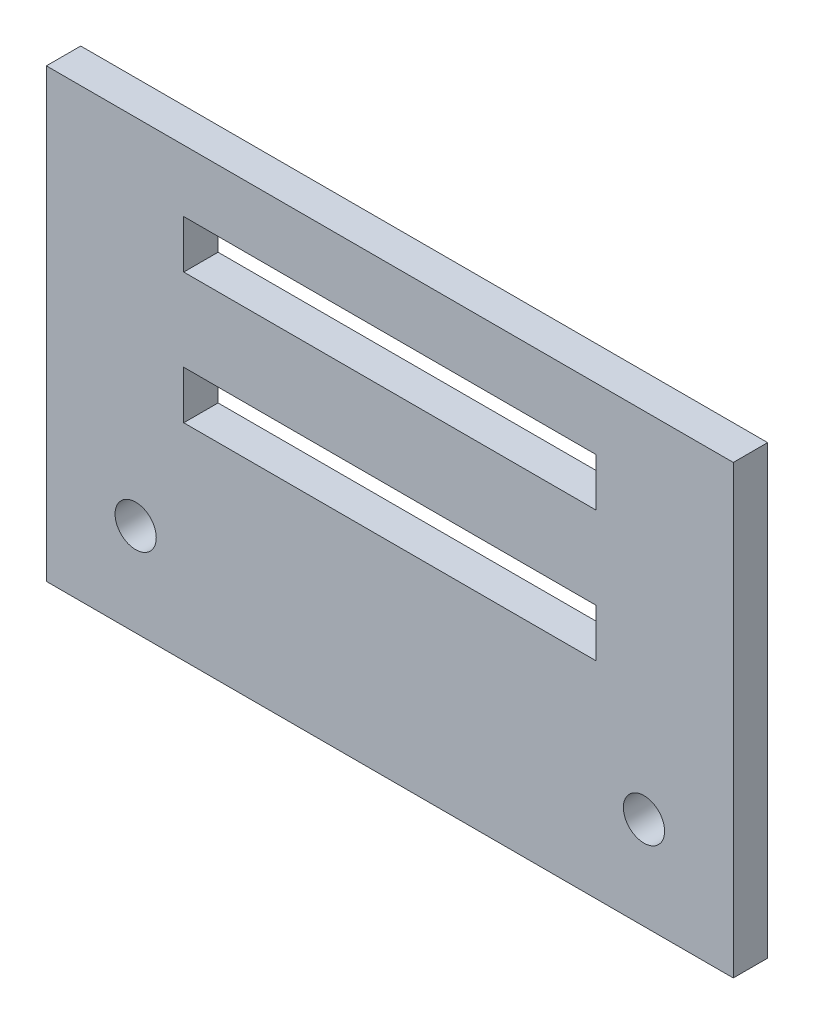
ISO-10303-21;
HEADER;
FILE_DESCRIPTION(('STEP AP214'),'2;1');
FILE_NAME('part.step','',(''),(''),'','','');
FILE_SCHEMA(('AUTOMOTIVE_DESIGN { 1 0 10303 214 1 1 1 1 }'));
ENDSEC;
DATA;
#1=APPLICATION_CONTEXT('core data for automotive mechanical design processes');
#2=APPLICATION_PROTOCOL_DEFINITION('international standard','automotive_design',2000,#1);
#3=PRODUCT_CONTEXT('',#1,'mechanical');
#4=PRODUCT('Part','Part','',(#3));
#5=PRODUCT_RELATED_PRODUCT_CATEGORY('part','',(#4));
#6=PRODUCT_DEFINITION_FORMATION('','',#4);
#7=PRODUCT_DEFINITION_CONTEXT('part definition',#1,'design');
#8=PRODUCT_DEFINITION('design','',#6,#7);
#9=PRODUCT_DEFINITION_SHAPE('','',#8);
#10=(LENGTH_UNIT() NAMED_UNIT(*) SI_UNIT(.MILLI.,.METRE.));
#11=(NAMED_UNIT(*) PLANE_ANGLE_UNIT() SI_UNIT($,.RADIAN.));
#12=(NAMED_UNIT(*) SI_UNIT($,.STERADIAN.) SOLID_ANGLE_UNIT());
#13=UNCERTAINTY_MEASURE_WITH_UNIT(LENGTH_MEASURE(1.E-05),#10,'distance_accuracy_value','');
#14=(GEOMETRIC_REPRESENTATION_CONTEXT(3) GLOBAL_UNCERTAINTY_ASSIGNED_CONTEXT((#13)) GLOBAL_UNIT_ASSIGNED_CONTEXT((#10,
#11,#12)) REPRESENTATION_CONTEXT('',''));
#15=CARTESIAN_POINT('',(0.,0.,0.));
#16=DIRECTION('',(0.,0.,1.));
#17=DIRECTION('',(1.,0.,0.));
#18=AXIS2_PLACEMENT_3D('',#15,#16,#17);
#19=CARTESIAN_POINT('',(0.,0.,0.125));
#20=DIRECTION('',(0.,0.,-1.));
#21=DIRECTION('',(-1.,0.,0.));
#22=AXIS2_PLACEMENT_3D('',#19,#20,#21);
#23=PLANE('',#22);
#24=DIRECTION('',(0.,-1.,0.));
#25=VECTOR('',#24,1.);
#26=CARTESIAN_POINT('',(1.,2.45,0.125));
#27=LINE('',#26,#25);
#28=CARTESIAN_POINT('',(1.,2.8,0.125));
#29=VERTEX_POINT('',#28);
#30=CARTESIAN_POINT('',(1.,2.45,0.125));
#31=VERTEX_POINT('',#30);
#32=EDGE_CURVE('E161',#29,#31,#27,.T.);
#33=ORIENTED_EDGE('',*,*,#32,.F.);
#34=DIRECTION('',(-1.,0.,0.));
#35=VECTOR('',#34,1.);
#36=CARTESIAN_POINT('',(1.,2.8,0.125));
#37=LINE('',#36,#35);
#38=CARTESIAN_POINT('',(4.,2.8,0.125));
#39=VERTEX_POINT('',#38);
#40=EDGE_CURVE('E169',#39,#29,#37,.T.);
#41=ORIENTED_EDGE('',*,*,#40,.F.);
#42=DIRECTION('',(0.,1.,0.));
#43=VECTOR('',#42,1.);
#44=CARTESIAN_POINT('',(4.,2.45,0.125));
#45=LINE('',#44,#43);
#46=CARTESIAN_POINT('',(4.,2.45,0.125));
#47=VERTEX_POINT('',#46);
#48=EDGE_CURVE('E166',#47,#39,#45,.T.);
#49=ORIENTED_EDGE('',*,*,#48,.F.);
#50=DIRECTION('',(1.,0.,0.));
#51=VECTOR('',#50,1.);
#52=CARTESIAN_POINT('',(1.,2.45,0.125));
#53=LINE('',#52,#51);
#54=EDGE_CURVE('E163',#31,#47,#53,.T.);
#55=ORIENTED_EDGE('',*,*,#54,.F.);
#56=EDGE_LOOP('',(#33,#41,#49,#55));
#57=FACE_BOUND('',#56,.T.);
#58=DIRECTION('',(0.,-1.,0.));
#59=VECTOR('',#58,1.);
#60=CARTESIAN_POINT('',(0.,0.,0.125));
#61=LINE('',#60,#59);
#62=CARTESIAN_POINT('',(0.,3.25,0.125));
#63=VERTEX_POINT('',#62);
#64=CARTESIAN_POINT('',(0.,0.,0.125));
#65=VERTEX_POINT('',#64);
#66=EDGE_CURVE('E192',#63,#65,#61,.T.);
#67=ORIENTED_EDGE('',*,*,#66,.T.);
#68=DIRECTION('',(1.,0.,0.));
#69=VECTOR('',#68,1.);
#70=CARTESIAN_POINT('',(0.,0.,0.125));
#71=LINE('',#70,#69);
#72=CARTESIAN_POINT('',(5.,0.,0.125));
#73=VERTEX_POINT('',#72);
#74=EDGE_CURVE('E195',#65,#73,#71,.T.);
#75=ORIENTED_EDGE('',*,*,#74,.T.);
#76=DIRECTION('',(0.,1.,0.));
#77=VECTOR('',#76,1.);
#78=CARTESIAN_POINT('',(5.,0.,0.125));
#79=LINE('',#78,#77);
#80=CARTESIAN_POINT('',(5.,3.25,0.125));
#81=VERTEX_POINT('',#80);
#82=EDGE_CURVE('E198',#73,#81,#79,.T.);
#83=ORIENTED_EDGE('',*,*,#82,.T.);
#84=DIRECTION('',(-1.,0.,0.));
#85=VECTOR('',#84,1.);
#86=CARTESIAN_POINT('',(0.,3.25,0.125));
#87=LINE('',#86,#85);
#88=EDGE_CURVE('E200',#81,#63,#87,.T.);
#89=ORIENTED_EDGE('',*,*,#88,.T.);
#90=EDGE_LOOP('',(#67,#75,#83,#89));
#91=FACE_BOUND('',#90,.T.);
#92=DIRECTION('',(0.,-1.,0.));
#93=VECTOR('',#92,1.);
#94=CARTESIAN_POINT('',(1.,1.85,0.125));
#95=LINE('',#94,#93);
#96=CARTESIAN_POINT('',(1.,1.85,0.125));
#97=VERTEX_POINT('',#96);
#98=CARTESIAN_POINT('',(1.,1.5,0.125));
#99=VERTEX_POINT('',#98);
#100=EDGE_CURVE('E122',#97,#99,#95,.T.);
#101=ORIENTED_EDGE('',*,*,#100,.F.);
#102=DIRECTION('',(-1.,0.,0.));
#103=VECTOR('',#102,1.);
#104=CARTESIAN_POINT('',(1.,1.85,0.125));
#105=LINE('',#104,#103);
#106=CARTESIAN_POINT('',(4.,1.85,0.125));
#107=VERTEX_POINT('',#106);
#108=EDGE_CURVE('E145',#107,#97,#105,.T.);
#109=ORIENTED_EDGE('',*,*,#108,.F.);
#110=DIRECTION('',(0.,1.,0.));
#111=VECTOR('',#110,1.);
#112=CARTESIAN_POINT('',(4.,1.85,0.125));
#113=LINE('',#112,#111);
#114=CARTESIAN_POINT('',(4.,1.5,0.125));
#115=VERTEX_POINT('',#114);
#116=EDGE_CURVE('E143',#115,#107,#113,.T.);
#117=ORIENTED_EDGE('',*,*,#116,.F.);
#118=DIRECTION('',(1.,0.,0.));
#119=VECTOR('',#118,1.);
#120=CARTESIAN_POINT('',(1.,1.5,0.125));
#121=LINE('',#120,#119);
#122=EDGE_CURVE('E130',#99,#115,#121,.T.);
#123=ORIENTED_EDGE('',*,*,#122,.F.);
#124=EDGE_LOOP('',(#101,#109,#117,#123));
#125=FACE_BOUND('',#124,.T.);
#126=CARTESIAN_POINT('',(0.65,0.675,0.125));
#127=DIRECTION('',(0.,0.,1.));
#128=DIRECTION('',(1.,0.,0.));
#129=AXIS2_PLACEMENT_3D('',#126,#127,#128);
#130=CIRCLE('',#129,0.15);
#131=CARTESIAN_POINT('',(0.8,0.675,0.125));
#132=VERTEX_POINT('',#131);
#133=EDGE_CURVE('E151',#132,#132,#130,.T.);
#134=ORIENTED_EDGE('',*,*,#133,.F.);
#135=EDGE_LOOP('',(#134));
#136=FACE_BOUND('',#135,.T.);
#137=CARTESIAN_POINT('',(4.35,0.675,0.125));
#138=DIRECTION('',(0.,0.,1.));
#139=DIRECTION('',(1.,0.,0.));
#140=AXIS2_PLACEMENT_3D('',#137,#138,#139);
#141=CIRCLE('',#140,0.15);
#142=CARTESIAN_POINT('',(4.5,0.675,0.125));
#143=VERTEX_POINT('',#142);
#144=EDGE_CURVE('E308',#143,#143,#141,.T.);
#145=ORIENTED_EDGE('',*,*,#144,.F.);
#146=EDGE_LOOP('',(#145));
#147=FACE_BOUND('',#146,.T.);
#148=ADVANCED_FACE('F33',(#57,#91,#125,#136,#147),#23,.F.);
#149=CARTESIAN_POINT('',(0.,0.,-0.125));
#150=DIRECTION('',(0.,0.,-1.));
#151=DIRECTION('',(-1.,0.,0.));
#152=AXIS2_PLACEMENT_3D('',#149,#150,#151);
#153=PLANE('',#152);
#154=CARTESIAN_POINT('',(0.65,0.675,-0.125));
#155=DIRECTION('',(0.,0.,1.));
#156=DIRECTION('',(1.,0.,0.));
#157=AXIS2_PLACEMENT_3D('',#154,#155,#156);
#158=CIRCLE('',#157,0.15);
#159=CARTESIAN_POINT('',(0.8,0.675,-0.125));
#160=VERTEX_POINT('',#159);
#161=EDGE_CURVE('E314',#160,#160,#158,.T.);
#162=ORIENTED_EDGE('',*,*,#161,.T.);
#163=EDGE_LOOP('',(#162));
#164=FACE_BOUND('',#163,.T.);
#165=DIRECTION('',(0.,-1.,0.));
#166=VECTOR('',#165,1.);
#167=CARTESIAN_POINT('',(0.,0.,-0.125));
#168=LINE('',#167,#166);
#169=CARTESIAN_POINT('',(0.,3.25,-0.125));
#170=VERTEX_POINT('',#169);
#171=CARTESIAN_POINT('',(0.,0.,-0.125));
#172=VERTEX_POINT('',#171);
#173=EDGE_CURVE('E191',#170,#172,#168,.T.);
#174=ORIENTED_EDGE('',*,*,#173,.F.);
#175=DIRECTION('',(-1.,0.,0.));
#176=VECTOR('',#175,1.);
#177=CARTESIAN_POINT('',(0.,3.25,-0.125));
#178=LINE('',#177,#176);
#179=CARTESIAN_POINT('',(5.,3.25,-0.125));
#180=VERTEX_POINT('',#179);
#181=EDGE_CURVE('E196',#180,#170,#178,.T.);
#182=ORIENTED_EDGE('',*,*,#181,.F.);
#183=DIRECTION('',(0.,1.,0.));
#184=VECTOR('',#183,1.);
#185=CARTESIAN_POINT('',(5.,0.,-0.125));
#186=LINE('',#185,#184);
#187=CARTESIAN_POINT('',(5.,0.,-0.125));
#188=VERTEX_POINT('',#187);
#189=EDGE_CURVE('E207',#188,#180,#186,.T.);
#190=ORIENTED_EDGE('',*,*,#189,.F.);
#191=DIRECTION('',(1.,0.,0.));
#192=VECTOR('',#191,1.);
#193=CARTESIAN_POINT('',(0.,0.,-0.125));
#194=LINE('',#193,#192);
#195=EDGE_CURVE('E205',#172,#188,#194,.T.);
#196=ORIENTED_EDGE('',*,*,#195,.F.);
#197=EDGE_LOOP('',(#174,#182,#190,#196));
#198=FACE_BOUND('',#197,.T.);
#199=DIRECTION('',(-1.,0.,0.));
#200=VECTOR('',#199,1.);
#201=CARTESIAN_POINT('',(1.,2.8,-0.125));
#202=LINE('',#201,#200);
#203=CARTESIAN_POINT('',(4.,2.8,-0.125));
#204=VERTEX_POINT('',#203);
#205=CARTESIAN_POINT('',(1.,2.8,-0.125));
#206=VERTEX_POINT('',#205);
#207=EDGE_CURVE('E164',#204,#206,#202,.T.);
#208=ORIENTED_EDGE('',*,*,#207,.T.);
#209=DIRECTION('',(0.,-1.,0.));
#210=VECTOR('',#209,1.);
#211=CARTESIAN_POINT('',(1.,2.45,-0.125));
#212=LINE('',#211,#210);
#213=CARTESIAN_POINT('',(1.,2.45,-0.125));
#214=VERTEX_POINT('',#213);
#215=EDGE_CURVE('E138',#206,#214,#212,.T.);
#216=ORIENTED_EDGE('',*,*,#215,.T.);
#217=DIRECTION('',(1.,0.,0.));
#218=VECTOR('',#217,1.);
#219=CARTESIAN_POINT('',(1.,2.45,-0.125));
#220=LINE('',#219,#218);
#221=CARTESIAN_POINT('',(4.,2.45,-0.125));
#222=VERTEX_POINT('',#221);
#223=EDGE_CURVE('E174',#214,#222,#220,.T.);
#224=ORIENTED_EDGE('',*,*,#223,.T.);
#225=DIRECTION('',(0.,1.,0.));
#226=VECTOR('',#225,1.);
#227=CARTESIAN_POINT('',(4.,2.45,-0.125));
#228=LINE('',#227,#226);
#229=EDGE_CURVE('E177',#222,#204,#228,.T.);
#230=ORIENTED_EDGE('',*,*,#229,.T.);
#231=EDGE_LOOP('',(#208,#216,#224,#230));
#232=FACE_BOUND('',#231,.T.);
#233=DIRECTION('',(-1.,0.,0.));
#234=VECTOR('',#233,1.);
#235=CARTESIAN_POINT('',(1.,1.85,-0.125));
#236=LINE('',#235,#234);
#237=CARTESIAN_POINT('',(4.,1.85,-0.125));
#238=VERTEX_POINT('',#237);
#239=CARTESIAN_POINT('',(1.,1.85,-0.125));
#240=VERTEX_POINT('',#239);
#241=EDGE_CURVE('E131',#238,#240,#236,.T.);
#242=ORIENTED_EDGE('',*,*,#241,.T.);
#243=DIRECTION('',(0.,-1.,0.));
#244=VECTOR('',#243,1.);
#245=CARTESIAN_POINT('',(1.,1.85,-0.125));
#246=LINE('',#245,#244);
#247=CARTESIAN_POINT('',(1.,1.5,-0.125));
#248=VERTEX_POINT('',#247);
#249=EDGE_CURVE('E56',#240,#248,#246,.T.);
#250=ORIENTED_EDGE('',*,*,#249,.T.);
#251=DIRECTION('',(1.,0.,0.));
#252=VECTOR('',#251,1.);
#253=CARTESIAN_POINT('',(1.,1.5,-0.125));
#254=LINE('',#253,#252);
#255=CARTESIAN_POINT('',(4.,1.5,-0.125));
#256=VERTEX_POINT('',#255);
#257=EDGE_CURVE('E137',#248,#256,#254,.T.);
#258=ORIENTED_EDGE('',*,*,#257,.T.);
#259=DIRECTION('',(0.,1.,0.));
#260=VECTOR('',#259,1.);
#261=CARTESIAN_POINT('',(4.,1.85,-0.125));
#262=LINE('',#261,#260);
#263=EDGE_CURVE('E153',#256,#238,#262,.T.);
#264=ORIENTED_EDGE('',*,*,#263,.T.);
#265=EDGE_LOOP('',(#242,#250,#258,#264));
#266=FACE_BOUND('',#265,.T.);
#267=CARTESIAN_POINT('',(4.35,0.675,-0.125));
#268=DIRECTION('',(0.,0.,1.));
#269=DIRECTION('',(1.,0.,0.));
#270=AXIS2_PLACEMENT_3D('',#267,#268,#269);
#271=CIRCLE('',#270,0.15);
#272=CARTESIAN_POINT('',(4.5,0.675,-0.125));
#273=VERTEX_POINT('',#272);
#274=EDGE_CURVE('E311',#273,#273,#271,.T.);
#275=ORIENTED_EDGE('',*,*,#274,.T.);
#276=EDGE_LOOP('',(#275));
#277=FACE_BOUND('',#276,.T.);
#278=ADVANCED_FACE('F225',(#164,#198,#232,#266,#277),#153,.T.);
#279=CARTESIAN_POINT('',(0.,0.,0.125));
#280=DIRECTION('',(1.,0.,0.));
#281=DIRECTION('',(0.,0.,-1.));
#282=AXIS2_PLACEMENT_3D('',#279,#280,#281);
#283=PLANE('',#282);
#284=ORIENTED_EDGE('',*,*,#173,.T.);
#285=DIRECTION('',(0.,0.,-1.));
#286=VECTOR('',#285,1.);
#287=CARTESIAN_POINT('',(0.,0.,0.125));
#288=LINE('',#287,#286);
#289=EDGE_CURVE('E11',#65,#172,#288,.T.);
#290=ORIENTED_EDGE('',*,*,#289,.F.);
#291=ORIENTED_EDGE('',*,*,#66,.F.);
#292=DIRECTION('',(0.,0.,-1.));
#293=VECTOR('',#292,1.);
#294=CARTESIAN_POINT('',(0.,3.25,0.125));
#295=LINE('',#294,#293);
#296=EDGE_CURVE('E202',#63,#170,#295,.T.);
#297=ORIENTED_EDGE('',*,*,#296,.T.);
#298=EDGE_LOOP('',(#284,#290,#291,#297));
#299=FACE_BOUND('',#298,.T.);
#300=ADVANCED_FACE('F35',(#299),#283,.F.);
#301=CARTESIAN_POINT('',(0.,0.,0.125));
#302=DIRECTION('',(0.,1.,0.));
#303=DIRECTION('',(0.,0.,1.));
#304=AXIS2_PLACEMENT_3D('',#301,#302,#303);
#305=PLANE('',#304);
#306=ORIENTED_EDGE('',*,*,#195,.T.);
#307=DIRECTION('',(0.,0.,-1.));
#308=VECTOR('',#307,1.);
#309=CARTESIAN_POINT('',(5.,0.,0.125));
#310=LINE('',#309,#308);
#311=EDGE_CURVE('E41',#73,#188,#310,.T.);
#312=ORIENTED_EDGE('',*,*,#311,.F.);
#313=ORIENTED_EDGE('',*,*,#74,.F.);
#314=ORIENTED_EDGE('',*,*,#289,.T.);
#315=EDGE_LOOP('',(#306,#312,#313,#314));
#316=FACE_BOUND('',#315,.T.);
#317=ADVANCED_FACE('F235',(#316),#305,.F.);
#318=CARTESIAN_POINT('',(5.,0.,0.125));
#319=DIRECTION('',(-1.,0.,0.));
#320=DIRECTION('',(0.,0.,1.));
#321=AXIS2_PLACEMENT_3D('',#318,#319,#320);
#322=PLANE('',#321);
#323=ORIENTED_EDGE('',*,*,#189,.T.);
#324=DIRECTION('',(0.,0.,-1.));
#325=VECTOR('',#324,1.);
#326=CARTESIAN_POINT('',(5.,3.25,0.125));
#327=LINE('',#326,#325);
#328=EDGE_CURVE('E212',#81,#180,#327,.T.);
#329=ORIENTED_EDGE('',*,*,#328,.F.);
#330=ORIENTED_EDGE('',*,*,#82,.F.);
#331=ORIENTED_EDGE('',*,*,#311,.T.);
#332=EDGE_LOOP('',(#323,#329,#330,#331));
#333=FACE_BOUND('',#332,.T.);
#334=ADVANCED_FACE('F219',(#333),#322,.F.);
#335=CARTESIAN_POINT('',(0.,3.25,0.125));
#336=DIRECTION('',(0.,-1.,0.));
#337=DIRECTION('',(0.,0.,-1.));
#338=AXIS2_PLACEMENT_3D('',#335,#336,#337);
#339=PLANE('',#338);
#340=ORIENTED_EDGE('',*,*,#181,.T.);
#341=ORIENTED_EDGE('',*,*,#296,.F.);
#342=ORIENTED_EDGE('',*,*,#88,.F.);
#343=ORIENTED_EDGE('',*,*,#328,.T.);
#344=EDGE_LOOP('',(#340,#341,#342,#343));
#345=FACE_BOUND('',#344,.T.);
#346=ADVANCED_FACE('F229',(#345),#339,.F.);
#347=CARTESIAN_POINT('',(1.,2.45,0.125));
#348=DIRECTION('',(1.,0.,0.));
#349=DIRECTION('',(0.,1.,0.));
#350=AXIS2_PLACEMENT_3D('',#347,#348,#349);
#351=PLANE('',#350);
#352=ORIENTED_EDGE('',*,*,#215,.F.);
#353=DIRECTION('',(0.,0.,-1.));
#354=VECTOR('',#353,1.);
#355=CARTESIAN_POINT('',(1.,2.8,0.125));
#356=LINE('',#355,#354);
#357=EDGE_CURVE('E171',#29,#206,#356,.T.);
#358=ORIENTED_EDGE('',*,*,#357,.F.);
#359=ORIENTED_EDGE('',*,*,#32,.T.);
#360=DIRECTION('',(0.,0.,-1.));
#361=VECTOR('',#360,1.);
#362=CARTESIAN_POINT('',(1.,2.45,0.125));
#363=LINE('',#362,#361);
#364=EDGE_CURVE('E188',#31,#214,#363,.T.);
#365=ORIENTED_EDGE('',*,*,#364,.T.);
#366=EDGE_LOOP('',(#352,#358,#359,#365));
#367=FACE_BOUND('',#366,.T.);
#368=ADVANCED_FACE('F252',(#367),#351,.T.);
#369=CARTESIAN_POINT('',(1.,2.45,0.125));
#370=DIRECTION('',(0.,1.,0.));
#371=DIRECTION('',(0.,0.,1.));
#372=AXIS2_PLACEMENT_3D('',#369,#370,#371);
#373=PLANE('',#372);
#374=ORIENTED_EDGE('',*,*,#223,.F.);
#375=ORIENTED_EDGE('',*,*,#364,.F.);
#376=ORIENTED_EDGE('',*,*,#54,.T.);
#377=DIRECTION('',(0.,0.,-1.));
#378=VECTOR('',#377,1.);
#379=CARTESIAN_POINT('',(4.,2.45,0.125));
#380=LINE('',#379,#378);
#381=EDGE_CURVE('E186',#47,#222,#380,.T.);
#382=ORIENTED_EDGE('',*,*,#381,.T.);
#383=EDGE_LOOP('',(#374,#375,#376,#382));
#384=FACE_BOUND('',#383,.T.);
#385=ADVANCED_FACE('F259',(#384),#373,.T.);
#386=CARTESIAN_POINT('',(4.,2.45,0.125));
#387=DIRECTION('',(-1.,0.,0.));
#388=DIRECTION('',(0.,0.,1.));
#389=AXIS2_PLACEMENT_3D('',#386,#387,#388);
#390=PLANE('',#389);
#391=ORIENTED_EDGE('',*,*,#229,.F.);
#392=ORIENTED_EDGE('',*,*,#381,.F.);
#393=ORIENTED_EDGE('',*,*,#48,.T.);
#394=DIRECTION('',(0.,0.,-1.));
#395=VECTOR('',#394,1.);
#396=CARTESIAN_POINT('',(4.,2.8,0.125));
#397=LINE('',#396,#395);
#398=EDGE_CURVE('E184',#39,#204,#397,.T.);
#399=ORIENTED_EDGE('',*,*,#398,.T.);
#400=EDGE_LOOP('',(#391,#392,#393,#399));
#401=FACE_BOUND('',#400,.T.);
#402=ADVANCED_FACE('F264',(#401),#390,.T.);
#403=CARTESIAN_POINT('',(1.,2.8,0.125));
#404=DIRECTION('',(0.,-1.,0.));
#405=DIRECTION('',(0.,0.,-1.));
#406=AXIS2_PLACEMENT_3D('',#403,#404,#405);
#407=PLANE('',#406);
#408=ORIENTED_EDGE('',*,*,#207,.F.);
#409=ORIENTED_EDGE('',*,*,#398,.F.);
#410=ORIENTED_EDGE('',*,*,#40,.T.);
#411=ORIENTED_EDGE('',*,*,#357,.T.);
#412=EDGE_LOOP('',(#408,#409,#410,#411));
#413=FACE_BOUND('',#412,.T.);
#414=ADVANCED_FACE('F270',(#413),#407,.T.);
#415=CARTESIAN_POINT('',(1.,1.85,0.125));
#416=DIRECTION('',(1.,0.,0.));
#417=DIRECTION('',(0.,0.,-1.));
#418=AXIS2_PLACEMENT_3D('',#415,#416,#417);
#419=PLANE('',#418);
#420=ORIENTED_EDGE('',*,*,#249,.F.);
#421=DIRECTION('',(0.,0.,-1.));
#422=VECTOR('',#421,1.);
#423=CARTESIAN_POINT('',(1.,1.85,0.125));
#424=LINE('',#423,#422);
#425=EDGE_CURVE('E126',#97,#240,#424,.T.);
#426=ORIENTED_EDGE('',*,*,#425,.F.);
#427=ORIENTED_EDGE('',*,*,#100,.T.);
#428=DIRECTION('',(0.,0.,-1.));
#429=VECTOR('',#428,1.);
#430=CARTESIAN_POINT('',(1.,1.5,0.125));
#431=LINE('',#430,#429);
#432=EDGE_CURVE('E125',#99,#248,#431,.T.);
#433=ORIENTED_EDGE('',*,*,#432,.T.);
#434=EDGE_LOOP('',(#420,#426,#427,#433));
#435=FACE_BOUND('',#434,.T.);
#436=ADVANCED_FACE('F124',(#435),#419,.T.);
#437=CARTESIAN_POINT('',(1.,1.5,0.125));
#438=DIRECTION('',(0.,1.,0.));
#439=DIRECTION('',(0.,0.,1.));
#440=AXIS2_PLACEMENT_3D('',#437,#438,#439);
#441=PLANE('',#440);
#442=ORIENTED_EDGE('',*,*,#257,.F.);
#443=ORIENTED_EDGE('',*,*,#432,.F.);
#444=ORIENTED_EDGE('',*,*,#122,.T.);
#445=DIRECTION('',(0.,0.,-1.));
#446=VECTOR('',#445,1.);
#447=CARTESIAN_POINT('',(4.,1.5,0.125));
#448=LINE('',#447,#446);
#449=EDGE_CURVE('E139',#115,#256,#448,.T.);
#450=ORIENTED_EDGE('',*,*,#449,.T.);
#451=EDGE_LOOP('',(#442,#443,#444,#450));
#452=FACE_BOUND('',#451,.T.);
#453=ADVANCED_FACE('F134',(#452),#441,.T.);
#454=CARTESIAN_POINT('',(4.,1.85,0.125));
#455=DIRECTION('',(-1.,0.,0.));
#456=DIRECTION('',(0.,0.,1.));
#457=AXIS2_PLACEMENT_3D('',#454,#455,#456);
#458=PLANE('',#457);
#459=ORIENTED_EDGE('',*,*,#263,.F.);
#460=ORIENTED_EDGE('',*,*,#449,.F.);
#461=ORIENTED_EDGE('',*,*,#116,.T.);
#462=DIRECTION('',(0.,0.,-1.));
#463=VECTOR('',#462,1.);
#464=CARTESIAN_POINT('',(4.,1.85,0.125));
#465=LINE('',#464,#463);
#466=EDGE_CURVE('E48',#107,#238,#465,.T.);
#467=ORIENTED_EDGE('',*,*,#466,.T.);
#468=EDGE_LOOP('',(#459,#460,#461,#467));
#469=FACE_BOUND('',#468,.T.);
#470=ADVANCED_FACE('F289',(#469),#458,.T.);
#471=CARTESIAN_POINT('',(1.,1.85,0.125));
#472=DIRECTION('',(0.,-1.,0.));
#473=DIRECTION('',(0.,0.,-1.));
#474=AXIS2_PLACEMENT_3D('',#471,#472,#473);
#475=PLANE('',#474);
#476=ORIENTED_EDGE('',*,*,#241,.F.);
#477=ORIENTED_EDGE('',*,*,#466,.F.);
#478=ORIENTED_EDGE('',*,*,#108,.T.);
#479=ORIENTED_EDGE('',*,*,#425,.T.);
#480=EDGE_LOOP('',(#476,#477,#478,#479));
#481=FACE_BOUND('',#480,.T.);
#482=ADVANCED_FACE('F292',(#481),#475,.T.);
#483=CARTESIAN_POINT('',(0.65,0.675,0.125));
#484=DIRECTION('',(0.,0.,-1.));
#485=DIRECTION('',(-1.,0.,0.));
#486=AXIS2_PLACEMENT_3D('',#483,#484,#485);
#487=CYLINDRICAL_SURFACE('',#486,0.15);
#488=ORIENTED_EDGE('',*,*,#133,.T.);
#489=EDGE_LOOP('',(#488));
#490=FACE_BOUND('',#489,.T.);
#491=ORIENTED_EDGE('',*,*,#161,.F.);
#492=EDGE_LOOP('',(#491));
#493=FACE_BOUND('',#492,.T.);
#494=ADVANCED_FACE('F296',(#490,#493),#487,.F.);
#495=CARTESIAN_POINT('',(4.35,0.675,0.125));
#496=DIRECTION('',(0.,0.,-1.));
#497=DIRECTION('',(-1.,0.,0.));
#498=AXIS2_PLACEMENT_3D('',#495,#496,#497);
#499=CYLINDRICAL_SURFACE('',#498,0.15);
#500=ORIENTED_EDGE('',*,*,#144,.T.);
#501=EDGE_LOOP('',(#500));
#502=FACE_BOUND('',#501,.T.);
#503=ORIENTED_EDGE('',*,*,#274,.F.);
#504=EDGE_LOOP('',(#503));
#505=FACE_BOUND('',#504,.T.);
#506=ADVANCED_FACE('F299',(#502,#505),#499,.F.);
#507=CLOSED_SHELL('',(#148,#278,#300,#317,#334,#346,#368,#385,#402,#414,#436,#453,#470,#482,
#494,#506));
#508=MANIFOLD_SOLID_BREP('B2',#507);
#509=ADVANCED_BREP_SHAPE_REPRESENTATION('',(#18,#508),#14);
#510=SHAPE_DEFINITION_REPRESENTATION(#9,#509);
ENDSEC;
END-ISO-10303-21;
